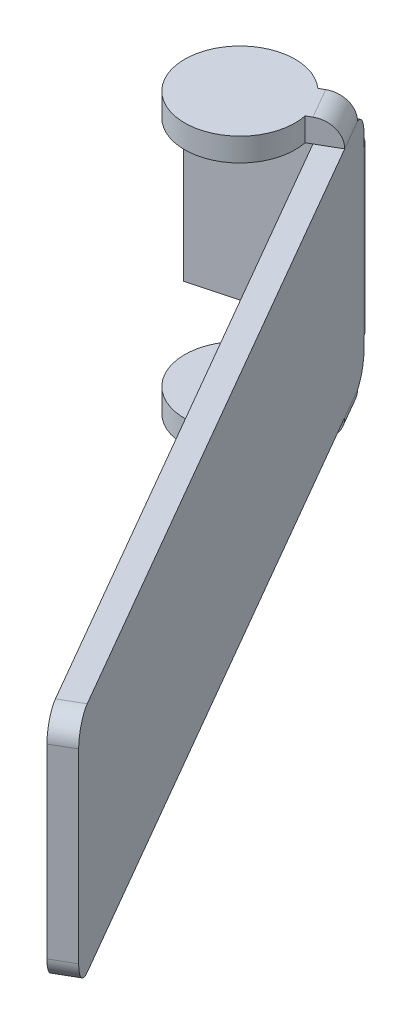
ISO-10303-21;
HEADER;
FILE_DESCRIPTION(('STEP AP214'),'2;1');
FILE_NAME('part.step','',(''),(''),'','','');
FILE_SCHEMA(('AUTOMOTIVE_DESIGN { 1 0 10303 214 1 1 1 1 }'));
ENDSEC;
DATA;
#1=APPLICATION_CONTEXT('core data for automotive mechanical design processes');
#2=APPLICATION_PROTOCOL_DEFINITION('international standard','automotive_design',2000,#1);
#3=PRODUCT_CONTEXT('',#1,'mechanical');
#4=PRODUCT('Part','Part','',(#3));
#5=PRODUCT_RELATED_PRODUCT_CATEGORY('part','',(#4));
#6=PRODUCT_DEFINITION_FORMATION('','',#4);
#7=PRODUCT_DEFINITION_CONTEXT('part definition',#1,'design');
#8=PRODUCT_DEFINITION('design','',#6,#7);
#9=PRODUCT_DEFINITION_SHAPE('','',#8);
#10=(LENGTH_UNIT() NAMED_UNIT(*) SI_UNIT(.MILLI.,.METRE.));
#11=(NAMED_UNIT(*) PLANE_ANGLE_UNIT() SI_UNIT($,.RADIAN.));
#12=(NAMED_UNIT(*) SI_UNIT($,.STERADIAN.) SOLID_ANGLE_UNIT());
#13=UNCERTAINTY_MEASURE_WITH_UNIT(LENGTH_MEASURE(1.E-05),#10,'distance_accuracy_value','');
#14=(GEOMETRIC_REPRESENTATION_CONTEXT(3) GLOBAL_UNCERTAINTY_ASSIGNED_CONTEXT((#13)) GLOBAL_UNIT_ASSIGNED_CONTEXT((#10,
#11,#12)) REPRESENTATION_CONTEXT('',''));
#15=CARTESIAN_POINT('',(0.,0.,0.));
#16=DIRECTION('',(0.,0.,1.));
#17=DIRECTION('',(1.,0.,0.));
#18=AXIS2_PLACEMENT_3D('',#15,#16,#17);
#19=CARTESIAN_POINT('',(94.3105301309,-97.95,18.44943405322));
#20=DIRECTION('',(0.,1.,0.));
#21=DIRECTION('',(0.,0.,1.));
#22=AXIS2_PLACEMENT_3D('',#19,#20,#21);
#23=PLANE('',#22);
#24=DIRECTION('',(0.866025403787722,0.,-0.499999999994313));
#25=VECTOR('',#24,1.);
#26=CARTESIAN_POINT('',(94.87326507878,-97.95,18.29774396034));
#27=LINE('',#26,#25);
#28=CARTESIAN_POINT('',(94.808012701891,-97.95,18.3354174377));
#29=VERTEX_POINT('',#28);
#30=CARTESIAN_POINT('',(94.765312374902,-97.95,18.3600704829828));
#31=VERTEX_POINT('',#30);
#32=EDGE_CURVE('E174',#29,#31,#27,.F.);
#33=ORIENTED_EDGE('',*,*,#32,.F.);
#34=DIRECTION('',(-0.50000000000021,0.,-0.866025403784317));
#35=VECTOR('',#34,1.);
#36=CARTESIAN_POINT('',(96.25752078541,-97.95,20.84603908433));
#37=LINE('',#36,#35);
#38=CARTESIAN_POINT('',(94.6580127018954,-97.949999949625,18.0756098165599));
#39=VERTEX_POINT('',#38);
#40=EDGE_CURVE('E146',#29,#39,#37,.T.);
#41=ORIENTED_EDGE('',*,*,#40,.T.);
#42=DIRECTION('',(0.866025403787722,0.,-0.499999999994313));
#43=VECTOR('',#42,1.);
#44=CARTESIAN_POINT('',(94.72326503323,-97.94999989925,18.0379363655));
#45=LINE('',#44,#43);
#46=CARTESIAN_POINT('',(94.6153122709678,-97.949999949625,18.1002629218509));
#47=VERTEX_POINT('',#46);
#48=EDGE_CURVE('E141',#39,#47,#45,.F.);
#49=ORIENTED_EDGE('',*,*,#48,.T.);
#50=CARTESIAN_POINT('',(94.3,-97.95,18.45551362713));
#51=DIRECTION('',(0.,-1.,0.));
#52=DIRECTION('',(0.,0.,-1.));
#53=AXIS2_PLACEMENT_3D('',#50,#51,#52);
#54=CIRCLE('',#53,0.4750000000021);
#55=EDGE_CURVE('E20',#31,#47,#54,.T.);
#56=ORIENTED_EDGE('',*,*,#55,.F.);
#57=EDGE_LOOP('',(#33,#41,#49,#56));
#58=FACE_BOUND('',#57,.T.);
#59=ADVANCED_FACE('F17',(#58),#23,.T.);
#60=CARTESIAN_POINT('',(94.3,-97.94081614968,18.45551362713));
#61=DIRECTION('',(0.,-1.,0.));
#62=DIRECTION('',(0.,0.,-1.));
#63=AXIS2_PLACEMENT_3D('',#60,#61,#62);
#64=CYLINDRICAL_SURFACE('',#63,0.4750000000021);
#65=DIRECTION('',(0.,1.,0.));
#66=VECTOR('',#65,1.);
#67=CARTESIAN_POINT('',(94.7653123749017,-98.05,18.3600704829829));
#68=LINE('',#67,#66);
#69=CARTESIAN_POINT('',(94.7653123749017,-98.15,18.360070482981));
#70=VERTEX_POINT('',#69);
#71=EDGE_CURVE('E159',#31,#70,#68,.F.);
#72=ORIENTED_EDGE('',*,*,#71,.F.);
#73=ORIENTED_EDGE('',*,*,#55,.T.);
#74=DIRECTION('',(0.,1.,0.));
#75=VECTOR('',#74,1.);
#76=CARTESIAN_POINT('',(94.615312167034,-98.05,18.1002629818571));
#77=LINE('',#76,#75);
#78=CARTESIAN_POINT('',(94.6153122709678,-98.15,18.1002629218509));
#79=VERTEX_POINT('',#78);
#80=EDGE_CURVE('E151',#47,#79,#77,.F.);
#81=ORIENTED_EDGE('',*,*,#80,.T.);
#82=CARTESIAN_POINT('',(94.3,-98.15,18.45551362713));
#83=DIRECTION('',(0.,-1.,0.));
#84=DIRECTION('',(0.,0.,-1.));
#85=AXIS2_PLACEMENT_3D('',#82,#83,#84);
#86=CIRCLE('',#85,0.4750000000021);
#87=EDGE_CURVE('E173',#79,#70,#86,.F.);
#88=ORIENTED_EDGE('',*,*,#87,.T.);
#89=EDGE_LOOP('',(#72,#73,#81,#88));
#90=FACE_BOUND('',#89,.T.);
#91=ADVANCED_FACE('F156',(#90),#64,.T.);
#92=CARTESIAN_POINT('',(93.54629438906,-96.95,18.11799855673));
#93=DIRECTION('',(0.965925826288354,0.,-0.258819045105188));
#94=DIRECTION('',(-0.258819045105188,0.,-0.965925826288354));
#95=AXIS2_PLACEMENT_3D('',#92,#93,#94);
#96=PLANE('',#95);
#97=DIRECTION('',(0.258819045097434,0.,0.965925826290431));
#98=VECTOR('',#97,1.);
#99=CARTESIAN_POINT('',(93.52041248455,-97.65,18.0214059741));
#100=LINE('',#99,#98);
#101=CARTESIAN_POINT('',(93.5204124845499,-97.65,18.0214059740998));
#102=VERTEX_POINT('',#101);
#103=CARTESIAN_POINT('',(93.57217629357,-97.65,18.2145911393599));
#104=VERTEX_POINT('',#103);
#105=EDGE_CURVE('E166',#102,#104,#100,.T.);
#106=ORIENTED_EDGE('',*,*,#105,.T.);
#107=DIRECTION('',(0.,1.,0.));
#108=VECTOR('',#107,1.);
#109=CARTESIAN_POINT('',(93.5721762935699,-96.95,18.2145911393598));
#110=LINE('',#109,#108);
#111=CARTESIAN_POINT('',(93.5721762935702,-96.25,18.2145911393599));
#112=VERTEX_POINT('',#111);
#113=EDGE_CURVE('E244',#112,#104,#110,.F.);
#114=ORIENTED_EDGE('',*,*,#113,.F.);
#115=DIRECTION('',(-0.258819045105188,0.,-0.965925826288354));
#116=VECTOR('',#115,1.);
#117=CARTESIAN_POINT('',(93.54629438906,-96.25,18.11799855673));
#118=LINE('',#117,#116);
#119=CARTESIAN_POINT('',(93.5204124845497,-96.25,18.0214059741));
#120=VERTEX_POINT('',#119);
#121=EDGE_CURVE('E161',#120,#112,#118,.F.);
#122=ORIENTED_EDGE('',*,*,#121,.F.);
#123=DIRECTION('',(0.,1.,0.));
#124=VECTOR('',#123,1.);
#125=CARTESIAN_POINT('',(93.5204124845499,-96.95,18.0214059740998));
#126=LINE('',#125,#124);
#127=EDGE_CURVE('E263',#120,#102,#126,.F.);
#128=ORIENTED_EDGE('',*,*,#127,.T.);
#129=EDGE_LOOP('',(#106,#114,#122,#128));
#130=FACE_BOUND('',#129,.T.);
#131=ADVANCED_FACE('F662',(#130),#96,.F.);
#132=CARTESIAN_POINT('',(94.07710258125,-96.95,18.07929654834));
#133=DIRECTION('',(0.258819045100197,0.,0.965925826289691));
#134=DIRECTION('',(0.965925826289691,0.,-0.258819045100197));
#135=AXIS2_PLACEMENT_3D('',#132,#133,#134);
#136=PLANE('',#135);
#137=ORIENTED_EDGE('',*,*,#113,.T.);
#138=DIRECTION('',(0.965925826289595,0.,-0.258819045100555));
#139=VECTOR('',#138,1.);
#140=CARTESIAN_POINT('',(93.57217629357,-97.65,18.21459113936));
#141=LINE('',#140,#139);
#142=CARTESIAN_POINT('',(94.5820288689307,-97.65,17.9440019573198));
#143=VERTEX_POINT('',#142);
#144=EDGE_CURVE('E267',#104,#143,#141,.T.);
#145=ORIENTED_EDGE('',*,*,#144,.T.);
#146=DIRECTION('',(0.,1.,0.));
#147=VECTOR('',#146,1.);
#148=CARTESIAN_POINT('',(94.5820288689312,-96.95,17.9440019573193));
#149=LINE('',#148,#147);
#150=CARTESIAN_POINT('',(94.582028868933,-96.25,17.9440019573189));
#151=VERTEX_POINT('',#150);
#152=EDGE_CURVE('E175',#143,#151,#149,.T.);
#153=ORIENTED_EDGE('',*,*,#152,.T.);
#154=DIRECTION('',(0.965925826289595,0.,-0.258819045100555));
#155=VECTOR('',#154,1.);
#156=CARTESIAN_POINT('',(93.57217629357,-96.25,18.21459113936));
#157=LINE('',#156,#155);
#158=EDGE_CURVE('E333',#112,#151,#157,.T.);
#159=ORIENTED_EDGE('',*,*,#158,.F.);
#160=EDGE_LOOP('',(#137,#145,#153,#159));
#161=FACE_BOUND('',#160,.T.);
#162=ADVANCED_FACE('F654',(#161),#136,.T.);
#163=CARTESIAN_POINT('',(94.3,-95.95918385032,18.45551362713));
#164=DIRECTION('',(0.,1.,0.));
#165=DIRECTION('',(0.,0.,1.));
#166=AXIS2_PLACEMENT_3D('',#163,#164,#165);
#167=CYLINDRICAL_SURFACE('',#166,0.4750000000021);
#168=DIRECTION('',(0.,1.,0.));
#169=VECTOR('',#168,1.);
#170=CARTESIAN_POINT('',(94.6153123748949,-95.85,18.1002628618411));
#171=LINE('',#170,#169);
#172=CARTESIAN_POINT('',(94.6153123748957,-95.75,18.1002628618406));
#173=VERTEX_POINT('',#172);
#174=CARTESIAN_POINT('',(94.6153123748957,-95.95,18.1002628618406));
#175=VERTEX_POINT('',#174);
#176=EDGE_CURVE('E259',#173,#175,#171,.F.);
#177=ORIENTED_EDGE('',*,*,#176,.T.);
#178=CARTESIAN_POINT('',(94.3,-95.95,18.45551362713));
#179=DIRECTION('',(0.,1.,0.));
#180=DIRECTION('',(0.,0.,1.));
#181=AXIS2_PLACEMENT_3D('',#178,#179,#180);
#182=CIRCLE('',#181,0.4750000000021);
#183=CARTESIAN_POINT('',(94.765312374902,-95.95,18.3600704829828));
#184=VERTEX_POINT('',#183);
#185=EDGE_CURVE('E243',#175,#184,#182,.T.);
#186=ORIENTED_EDGE('',*,*,#185,.T.);
#187=DIRECTION('',(0.,1.,0.));
#188=VECTOR('',#187,1.);
#189=CARTESIAN_POINT('',(94.7653123749017,-95.85,18.3600704829829));
#190=LINE('',#189,#188);
#191=CARTESIAN_POINT('',(94.765312374902,-95.75,18.3600704829828));
#192=VERTEX_POINT('',#191);
#193=EDGE_CURVE('E182',#192,#184,#190,.F.);
#194=ORIENTED_EDGE('',*,*,#193,.F.);
#195=CARTESIAN_POINT('',(94.3,-95.75,18.45551362713));
#196=DIRECTION('',(0.,1.,0.));
#197=DIRECTION('',(0.,0.,1.));
#198=AXIS2_PLACEMENT_3D('',#195,#196,#197);
#199=CIRCLE('',#198,0.4750000000021);
#200=EDGE_CURVE('E242',#173,#192,#199,.T.);
#201=ORIENTED_EDGE('',*,*,#200,.F.);
#202=EDGE_LOOP('',(#177,#186,#194,#201));
#203=FACE_BOUND('',#202,.T.);
#204=ADVANCED_FACE('F434',(#203),#167,.T.);
#205=CARTESIAN_POINT('',(94.31052494748,-95.95,18.44943704587));
#206=DIRECTION('',(0.,1.,0.));
#207=DIRECTION('',(0.,0.,1.));
#208=AXIS2_PLACEMENT_3D('',#205,#206,#207);
#209=PLANE('',#208);
#210=ORIENTED_EDGE('',*,*,#185,.F.);
#211=DIRECTION('',(0.866025403787722,0.,-0.499999999994313));
#212=VECTOR('',#211,1.);
#213=CARTESIAN_POINT('',(94.72326507877,-95.95,18.0379363392));
#214=LINE('',#213,#212);
#215=CARTESIAN_POINT('',(94.6580127018925,-95.95,18.0756098165581));
#216=VERTEX_POINT('',#215);
#217=EDGE_CURVE('E319',#175,#216,#214,.T.);
#218=ORIENTED_EDGE('',*,*,#217,.T.);
#219=DIRECTION('',(-0.50000000000021,0.,-0.866025403784317));
#220=VECTOR('',#219,1.);
#221=CARTESIAN_POINT('',(96.25752078541,-95.95,20.84603908433));
#222=LINE('',#221,#220);
#223=CARTESIAN_POINT('',(94.808012701891,-95.95,18.3354174377));
#224=VERTEX_POINT('',#223);
#225=EDGE_CURVE('E241',#216,#224,#222,.F.);
#226=ORIENTED_EDGE('',*,*,#225,.T.);
#227=DIRECTION('',(0.866025403787722,0.,-0.499999999994313));
#228=VECTOR('',#227,1.);
#229=CARTESIAN_POINT('',(94.87326507878,-95.95,18.29774396034));
#230=LINE('',#229,#228);
#231=EDGE_CURVE('E184',#184,#224,#230,.T.);
#232=ORIENTED_EDGE('',*,*,#231,.F.);
#233=EDGE_LOOP('',(#210,#218,#226,#232));
#234=FACE_BOUND('',#233,.T.);
#235=ADVANCED_FACE('F433',(#234),#209,.F.);
#236=CARTESIAN_POINT('',(94.31050625137,-95.75,18.44944784007));
#237=DIRECTION('',(0.,1.,0.));
#238=DIRECTION('',(0.,0.,1.));
#239=AXIS2_PLACEMENT_3D('',#236,#237,#238);
#240=PLANE('',#239);
#241=DIRECTION('',(0.866025403787722,0.,-0.499999999994313));
#242=VECTOR('',#241,1.);
#243=CARTESIAN_POINT('',(94.87326507878,-95.75,18.29774396034));
#244=LINE('',#243,#242);
#245=CARTESIAN_POINT('',(94.8080127018915,-95.75,18.3354174377002));
#246=VERTEX_POINT('',#245);
#247=EDGE_CURVE('E185',#246,#192,#244,.F.);
#248=ORIENTED_EDGE('',*,*,#247,.F.);
#249=DIRECTION('',(-0.499999999997611,0.,-0.866025403785818));
#250=VECTOR('',#249,1.);
#251=CARTESIAN_POINT('',(94.8126046270506,-95.75,18.3433708853797));
#252=LINE('',#251,#250);
#253=CARTESIAN_POINT('',(94.6580127018892,-95.75,18.0756098165592));
#254=VERTEX_POINT('',#253);
#255=EDGE_CURVE('E235',#254,#246,#252,.F.);
#256=ORIENTED_EDGE('',*,*,#255,.F.);
#257=DIRECTION('',(0.866025403787722,0.,-0.499999999994313));
#258=VECTOR('',#257,1.);
#259=CARTESIAN_POINT('',(94.72326507877,-95.75,18.0379363392));
#260=LINE('',#259,#258);
#261=EDGE_CURVE('E326',#254,#173,#260,.F.);
#262=ORIENTED_EDGE('',*,*,#261,.T.);
#263=ORIENTED_EDGE('',*,*,#200,.T.);
#264=EDGE_LOOP('',(#248,#256,#262,#263));
#265=FACE_BOUND('',#264,.T.);
#266=ADVANCED_FACE('F439',(#265),#240,.T.);
#267=CARTESIAN_POINT('',(94.87326507878,-95.85,18.29774396034));
#268=DIRECTION('',(0.499999999994313,0.,0.866025403787722));
#269=DIRECTION('',(0.866025403787722,0.,-0.499999999994313));
#270=AXIS2_PLACEMENT_3D('',#267,#268,#269);
#271=PLANE('',#270);
#272=DIRECTION('',(-0.866025403788345,0.,0.499999999993235));
#273=VECTOR('',#272,1.);
#274=CARTESIAN_POINT('',(94.98121778265,-95.95,18.2354174377));
#275=LINE('',#274,#273);
#276=CARTESIAN_POINT('',(94.9812177826505,-95.95,18.2354174376992));
#277=VERTEX_POINT('',#276);
#278=EDGE_CURVE('E310',#277,#224,#275,.T.);
#279=ORIENTED_EDGE('',*,*,#278,.F.);
#280=CARTESIAN_POINT('',(94.8080127018907,-95.95,18.3354174376996));
#281=DIRECTION('',(-0.499999999997611,0.,-0.866025403785818));
#282=DIRECTION('',(-0.866025403785818,0.,0.499999999997611));
#283=AXIS2_PLACEMENT_3D('',#280,#281,#282);
#284=CIRCLE('',#283,0.2);
#285=EDGE_CURVE('E232',#246,#277,#284,.T.);
#286=ORIENTED_EDGE('',*,*,#285,.F.);
#287=ORIENTED_EDGE('',*,*,#247,.T.);
#288=ORIENTED_EDGE('',*,*,#193,.T.);
#289=ORIENTED_EDGE('',*,*,#231,.T.);
#290=EDGE_LOOP('',(#279,#286,#287,#288,#289));
#291=FACE_BOUND('',#290,.T.);
#292=ADVANCED_FACE('F414',(#291),#271,.T.);
#293=CARTESIAN_POINT('',(96.25752078541,-96.95,20.84603908433));
#294=DIRECTION('',(0.866025403784317,0.,-0.50000000000021));
#295=DIRECTION('',(-0.50000000000021,0.,-0.866025403784317));
#296=AXIS2_PLACEMENT_3D('',#293,#294,#295);
#297=PLANE('',#296);
#298=ORIENTED_EDGE('',*,*,#152,.F.);
#299=DIRECTION('',(0.,1.,0.));
#300=VECTOR('',#299,1.);
#301=CARTESIAN_POINT('',(94.5820288689268,-96.95,17.9440019573118));
#302=LINE('',#301,#300);
#303=CARTESIAN_POINT('',(94.5820288689321,-97.75585341908,17.9440019573143));
#304=VERTEX_POINT('',#303);
#305=EDGE_CURVE('E179',#304,#143,#302,.T.);
#306=ORIENTED_EDGE('',*,*,#305,.F.);
#307=CARTESIAN_POINT('',(94.6820288689319,-97.75585341908,18.1172070380699));
#308=DIRECTION('',(0.866025403783331,0.,-0.500000000001918));
#309=DIRECTION('',(-0.500000000001918,0.,-0.866025403783331));
#310=AXIS2_PLACEMENT_3D('',#307,#308,#309);
#311=CIRCLE('',#310,0.1999999999987);
#312=EDGE_CURVE('E237',#39,#304,#311,.T.);
#313=ORIENTED_EDGE('',*,*,#312,.F.);
#314=ORIENTED_EDGE('',*,*,#40,.F.);
#315=DIRECTION('',(0.500000000000419,0.,0.866025403784197));
#316=VECTOR('',#315,1.);
#317=CARTESIAN_POINT('',(94.80801270189,-97.95,18.3354174377));
#318=LINE('',#317,#316);
#319=CARTESIAN_POINT('',(97.8330127018894,-97.95,23.574871130591));
#320=VERTEX_POINT('',#319);
#321=EDGE_CURVE('E286',#29,#320,#318,.T.);
#322=ORIENTED_EDGE('',*,*,#321,.T.);
#323=CARTESIAN_POINT('',(97.8330127018888,-97.75,23.574871130592));
#324=DIRECTION('',(-0.866025403783331,0.,0.500000000001918));
#325=DIRECTION('',(0.500000000001918,0.,0.866025403783331));
#326=AXIS2_PLACEMENT_3D('',#323,#324,#325);
#327=CIRCLE('',#326,0.2);
#328=CARTESIAN_POINT('',(97.9330127018898,-97.75,23.7480762113497));
#329=VERTEX_POINT('',#328);
#330=EDGE_CURVE('E219',#329,#320,#327,.F.);
#331=ORIENTED_EDGE('',*,*,#330,.F.);
#332=DIRECTION('',(0.,1.,0.));
#333=VECTOR('',#332,1.);
#334=CARTESIAN_POINT('',(97.9330127018904,-96.95,23.7480762113507));
#335=LINE('',#334,#333);
#336=CARTESIAN_POINT('',(97.9330127018913,-96.15,23.7480762113502));
#337=VERTEX_POINT('',#336);
#338=EDGE_CURVE('E307',#337,#329,#335,.F.);
#339=ORIENTED_EDGE('',*,*,#338,.F.);
#340=CARTESIAN_POINT('',(97.8330127018906,-96.15,23.574871130591));
#341=DIRECTION('',(-0.866025403783331,0.,0.500000000001918));
#342=DIRECTION('',(0.500000000001918,0.,0.866025403783331));
#343=AXIS2_PLACEMENT_3D('',#340,#341,#342);
#344=CIRCLE('',#343,0.2000000000034);
#345=CARTESIAN_POINT('',(97.8330127018908,-95.9499999999983,23.5748711305914));
#346=VERTEX_POINT('',#345);
#347=EDGE_CURVE('E224',#346,#337,#344,.F.);
#348=ORIENTED_EDGE('',*,*,#347,.F.);
#349=DIRECTION('',(0.500000000000419,0.,0.866025403784197));
#350=VECTOR('',#349,1.);
#351=CARTESIAN_POINT('',(94.80801270189,-95.95,18.3354174377));
#352=LINE('',#351,#350);
#353=EDGE_CURVE('E231',#224,#346,#352,.T.);
#354=ORIENTED_EDGE('',*,*,#353,.F.);
#355=ORIENTED_EDGE('',*,*,#225,.F.);
#356=CARTESIAN_POINT('',(94.6820288689323,-96.14414658092,18.11720703807));
#357=DIRECTION('',(-0.866025403783331,0.,0.500000000001918));
#358=DIRECTION('',(0.500000000001918,0.,0.866025403783331));
#359=AXIS2_PLACEMENT_3D('',#356,#357,#358);
#360=CIRCLE('',#359,0.1999999999986);
#361=CARTESIAN_POINT('',(94.5820288689323,-96.14414658092,17.9440019573177));
#362=VERTEX_POINT('',#361);
#363=EDGE_CURVE('E239',#362,#216,#360,.F.);
#364=ORIENTED_EDGE('',*,*,#363,.F.);
#365=DIRECTION('',(0.,1.,0.));
#366=VECTOR('',#365,1.);
#367=CARTESIAN_POINT('',(94.5820288689312,-96.95,17.9440019573193));
#368=LINE('',#367,#366);
#369=EDGE_CURVE('E178',#151,#362,#368,.T.);
#370=ORIENTED_EDGE('',*,*,#369,.F.);
#371=EDGE_LOOP('',(#298,#306,#313,#314,#322,#331,#339,#348,#354,#355,#364,#370));
#372=FACE_BOUND('',#371,.T.);
#373=ADVANCED_FACE('F431',(#372),#297,.F.);
#374=CARTESIAN_POINT('',(94.87326507878,-98.05,18.29774396034));
#375=DIRECTION('',(0.499999999994313,0.,0.866025403787722));
#376=DIRECTION('',(0.866025403787722,0.,-0.499999999994313));
#377=AXIS2_PLACEMENT_3D('',#374,#375,#376);
#378=PLANE('',#377);
#379=DIRECTION('',(0.866025403803395,0.,-0.499999999967167));
#380=VECTOR('',#379,1.);
#381=CARTESIAN_POINT('',(94.7653123749,-98.15,18.36007048298));
#382=LINE('',#381,#380);
#383=CARTESIAN_POINT('',(94.8080127018914,-98.15,18.3354174377003));
#384=VERTEX_POINT('',#383);
#385=EDGE_CURVE('E152',#70,#384,#382,.T.);
#386=ORIENTED_EDGE('',*,*,#385,.T.);
#387=CARTESIAN_POINT('',(94.8080127018929,-97.95,18.3354174377006));
#388=DIRECTION('',(0.500000000001918,0.,0.866025403783331));
#389=DIRECTION('',(0.866025403783331,0.,-0.500000000001918));
#390=AXIS2_PLACEMENT_3D('',#387,#388,#389);
#391=CIRCLE('',#390,0.2);
#392=CARTESIAN_POINT('',(94.9812177826518,-97.95,18.2354174377001));
#393=VERTEX_POINT('',#392);
#394=EDGE_CURVE('E215',#393,#384,#391,.F.);
#395=ORIENTED_EDGE('',*,*,#394,.F.);
#396=DIRECTION('',(-0.866025403788345,0.,0.499999999993235));
#397=VECTOR('',#396,1.);
#398=CARTESIAN_POINT('',(94.98121778265,-97.95,18.2354174377));
#399=LINE('',#398,#397);
#400=EDGE_CURVE('E222',#393,#29,#399,.T.);
#401=ORIENTED_EDGE('',*,*,#400,.T.);
#402=ORIENTED_EDGE('',*,*,#32,.T.);
#403=ORIENTED_EDGE('',*,*,#71,.T.);
#404=EDGE_LOOP('',(#386,#395,#401,#402,#403));
#405=FACE_BOUND('',#404,.T.);
#406=ADVANCED_FACE('F609',(#405),#378,.T.);
#407=CARTESIAN_POINT('',(94.31050625137,-98.15,18.44944784007));
#408=DIRECTION('',(0.,1.,0.));
#409=DIRECTION('',(0.,0.,1.));
#410=AXIS2_PLACEMENT_3D('',#407,#408,#409);
#411=PLANE('',#410);
#412=ORIENTED_EDGE('',*,*,#87,.F.);
#413=DIRECTION('',(0.866025403787722,0.,-0.499999999994313));
#414=VECTOR('',#413,1.);
#415=CARTESIAN_POINT('',(94.72326503323,-98.15,18.0379363655));
#416=LINE('',#415,#414);
#417=CARTESIAN_POINT('',(94.6580127018892,-98.15,18.0756098165624));
#418=VERTEX_POINT('',#417);
#419=EDGE_CURVE('E164',#79,#418,#416,.T.);
#420=ORIENTED_EDGE('',*,*,#419,.T.);
#421=DIRECTION('',(0.500000000001918,0.,0.866025403783331));
#422=VECTOR('',#421,1.);
#423=CARTESIAN_POINT('',(94.6534207767281,-98.15,18.0676563688811));
#424=LINE('',#423,#422);
#425=EDGE_CURVE('E214',#384,#418,#424,.F.);
#426=ORIENTED_EDGE('',*,*,#425,.F.);
#427=ORIENTED_EDGE('',*,*,#385,.F.);
#428=EDGE_LOOP('',(#412,#420,#426,#427));
#429=FACE_BOUND('',#428,.T.);
#430=ADVANCED_FACE('F601',(#429),#411,.F.);
#431=CARTESIAN_POINT('',(94.72326503323,-98.05,18.0379363655));
#432=DIRECTION('',(0.499999999994313,0.,0.866025403787722));
#433=DIRECTION('',(0.866025403787722,0.,-0.499999999994313));
#434=AXIS2_PLACEMENT_3D('',#431,#432,#433);
#435=PLANE('',#434);
#436=ORIENTED_EDGE('',*,*,#419,.F.);
#437=ORIENTED_EDGE('',*,*,#80,.F.);
#438=ORIENTED_EDGE('',*,*,#48,.F.);
#439=DIRECTION('',(0.866025403783331,0.,-0.500000000001918));
#440=VECTOR('',#439,1.);
#441=CARTESIAN_POINT('',(94.6500592542132,-97.95,18.0802017417195));
#442=LINE('',#441,#440);
#443=CARTESIAN_POINT('',(94.8312177826484,-97.95,17.9756098165597));
#444=VERTEX_POINT('',#443);
#445=EDGE_CURVE('E213',#444,#39,#442,.F.);
#446=ORIENTED_EDGE('',*,*,#445,.F.);
#447=CARTESIAN_POINT('',(94.6580127018893,-97.95,18.0756098165604));
#448=DIRECTION('',(0.500000000001918,0.,0.866025403783331));
#449=DIRECTION('',(0.866025403783331,0.,-0.500000000001918));
#450=AXIS2_PLACEMENT_3D('',#447,#448,#449);
#451=CIRCLE('',#450,0.2);
#452=EDGE_CURVE('E210',#418,#444,#451,.T.);
#453=ORIENTED_EDGE('',*,*,#452,.F.);
#454=EDGE_LOOP('',(#436,#437,#438,#446,#453));
#455=FACE_BOUND('',#454,.T.);
#456=ADVANCED_FACE('F162',(#455),#435,.F.);
#457=CARTESIAN_POINT('',(94.11540883032,-97.65,17.94564491796));
#458=DIRECTION('',(0.,1.,0.));
#459=DIRECTION('',(0.,0.,1.));
#460=AXIS2_PLACEMENT_3D('',#457,#458,#459);
#461=PLANE('',#460);
#462=ORIENTED_EDGE('',*,*,#144,.F.);
#463=ORIENTED_EDGE('',*,*,#105,.F.);
#464=DIRECTION('',(0.965925826289691,0.,-0.258819045100197));
#465=VECTOR('',#464,1.);
#466=CARTESIAN_POINT('',(94.02533877223,-97.65,17.88611138308));
#467=LINE('',#466,#465);
#468=CARTESIAN_POINT('',(94.5302650599097,-97.65,17.7508167920598));
#469=VERTEX_POINT('',#468);
#470=EDGE_CURVE('E266',#102,#469,#467,.T.);
#471=ORIENTED_EDGE('',*,*,#470,.T.);
#472=CARTESIAN_POINT('',(94.58202886893,-97.65,17.94400195732));
#473=DIRECTION('',(0.,1.,0.));
#474=DIRECTION('',(0.,0.,1.));
#475=AXIS2_PLACEMENT_3D('',#472,#473,#474);
#476=CIRCLE('',#475,0.2000000000027);
#477=CARTESIAN_POINT('',(94.7552339496904,-97.65,17.8440019573193));
#478=VERTEX_POINT('',#477);
#479=EDGE_CURVE('E206',#478,#469,#476,.T.);
#480=ORIENTED_EDGE('',*,*,#479,.F.);
#481=DIRECTION('',(0.866025403784162,0.,-0.500000000000478));
#482=VECTOR('',#481,1.);
#483=CARTESIAN_POINT('',(94.66863140931,-97.65,17.89400195732));
#484=LINE('',#483,#482);
#485=EDGE_CURVE('E209',#478,#143,#484,.F.);
#486=ORIENTED_EDGE('',*,*,#485,.T.);
#487=EDGE_LOOP('',(#462,#463,#471,#480,#486));
#488=FACE_BOUND('',#487,.T.);
#489=ADVANCED_FACE('F344',(#488),#461,.F.);
#490=CARTESIAN_POINT('',(94.02533877223,-96.95,17.88611138308));
#491=DIRECTION('',(0.258819045100197,0.,0.965925826289691));
#492=DIRECTION('',(0.965925826289691,0.,-0.258819045100197));
#493=AXIS2_PLACEMENT_3D('',#490,#491,#492);
#494=PLANE('',#493);
#495=ORIENTED_EDGE('',*,*,#127,.F.);
#496=DIRECTION('',(-0.965925826289595,0.,0.258819045100555));
#497=VECTOR('',#496,1.);
#498=CARTESIAN_POINT('',(94.53026505991,-96.25,17.75081679206));
#499=LINE('',#498,#497);
#500=CARTESIAN_POINT('',(94.5302650599096,-96.25,17.7508167920597));
#501=VERTEX_POINT('',#500);
#502=EDGE_CURVE('E330',#501,#120,#499,.T.);
#503=ORIENTED_EDGE('',*,*,#502,.F.);
#504=DIRECTION('',(0.,1.,0.));
#505=VECTOR('',#504,1.);
#506=CARTESIAN_POINT('',(94.5302650599098,-97.678,17.7508167920593));
#507=LINE('',#506,#505);
#508=EDGE_CURVE('E205',#469,#501,#507,.T.);
#509=ORIENTED_EDGE('',*,*,#508,.F.);
#510=ORIENTED_EDGE('',*,*,#470,.F.);
#511=EDGE_LOOP('',(#495,#503,#509,#510));
#512=FACE_BOUND('',#511,.T.);
#513=ADVANCED_FACE('F350',(#512),#494,.F.);
#514=CARTESIAN_POINT('',(94.11540883032,-96.25,17.94564491796));
#515=DIRECTION('',(0.,1.,0.));
#516=DIRECTION('',(0.,0.,1.));
#517=AXIS2_PLACEMENT_3D('',#514,#515,#516);
#518=PLANE('',#517);
#519=DIRECTION('',(0.866025403784162,0.,-0.500000000000478));
#520=VECTOR('',#519,1.);
#521=CARTESIAN_POINT('',(94.66863140931,-96.25,17.89400195732));
#522=LINE('',#521,#520);
#523=CARTESIAN_POINT('',(94.7552339496904,-96.25,17.8440019573193));
#524=VERTEX_POINT('',#523);
#525=EDGE_CURVE('E204',#151,#524,#522,.T.);
#526=ORIENTED_EDGE('',*,*,#525,.T.);
#527=CARTESIAN_POINT('',(94.58202886893,-96.25,17.94400195732));
#528=DIRECTION('',(0.,1.,0.));
#529=DIRECTION('',(0.,0.,1.));
#530=AXIS2_PLACEMENT_3D('',#527,#528,#529);
#531=CIRCLE('',#530,0.2000000000027);
#532=EDGE_CURVE('E201',#501,#524,#531,.F.);
#533=ORIENTED_EDGE('',*,*,#532,.F.);
#534=ORIENTED_EDGE('',*,*,#502,.T.);
#535=ORIENTED_EDGE('',*,*,#121,.T.);
#536=ORIENTED_EDGE('',*,*,#158,.T.);
#537=EDGE_LOOP('',(#526,#533,#534,#535,#536));
#538=FACE_BOUND('',#537,.T.);
#539=ADVANCED_FACE('F428',(#538),#518,.T.);
#540=CARTESIAN_POINT('',(94.72326507877,-95.85,18.0379363392));
#541=DIRECTION('',(0.499999999994313,0.,0.866025403787722));
#542=DIRECTION('',(0.866025403787722,0.,-0.499999999994313));
#543=AXIS2_PLACEMENT_3D('',#540,#541,#542);
#544=PLANE('',#543);
#545=ORIENTED_EDGE('',*,*,#176,.F.);
#546=ORIENTED_EDGE('',*,*,#261,.F.);
#547=CARTESIAN_POINT('',(94.6580127018899,-95.95,18.0756098165612));
#548=DIRECTION('',(-0.499999999997611,0.,-0.866025403785818));
#549=DIRECTION('',(-0.866025403785818,0.,0.499999999997611));
#550=AXIS2_PLACEMENT_3D('',#547,#548,#549);
#551=CIRCLE('',#550,0.2);
#552=CARTESIAN_POINT('',(94.8312177826486,-95.9500000000001,17.9756098165598));
#553=VERTEX_POINT('',#552);
#554=EDGE_CURVE('E228',#553,#254,#551,.F.);
#555=ORIENTED_EDGE('',*,*,#554,.F.);
#556=DIRECTION('',(-0.866025403783331,0.,0.500000000001918));
#557=VECTOR('',#556,1.);
#558=CARTESIAN_POINT('',(94.8391712303321,-95.9500000000006,17.9710178913976));
#559=LINE('',#558,#557);
#560=EDGE_CURVE('E380',#216,#553,#559,.F.);
#561=ORIENTED_EDGE('',*,*,#560,.F.);
#562=ORIENTED_EDGE('',*,*,#217,.F.);
#563=EDGE_LOOP('',(#545,#546,#555,#561,#562));
#564=FACE_BOUND('',#563,.T.);
#565=ADVANCED_FACE('F440',(#564),#544,.F.);
#566=CARTESIAN_POINT('',(94.81260462705,-95.95,18.34337088538));
#567=DIRECTION('',(-0.499999999997611,0.,-0.866025403785818));
#568=DIRECTION('',(-0.866025403785818,0.,0.499999999997611));
#569=AXIS2_PLACEMENT_3D('',#566,#567,#568);
#570=CYLINDRICAL_SURFACE('',#569,0.2);
#571=DIRECTION('',(-0.50000000000021,0.,-0.866025403784317));
#572=VECTOR('',#571,1.);
#573=CARTESIAN_POINT('',(96.43072586617,-95.95,20.74603908433));
#574=LINE('',#573,#572);
#575=EDGE_CURVE('E377',#553,#277,#574,.F.);
#576=ORIENTED_EDGE('',*,*,#575,.F.);
#577=ORIENTED_EDGE('',*,*,#554,.T.);
#578=ORIENTED_EDGE('',*,*,#255,.T.);
#579=ORIENTED_EDGE('',*,*,#285,.T.);
#580=EDGE_LOOP('',(#576,#577,#578,#579));
#581=FACE_BOUND('',#580,.T.);
#582=ADVANCED_FACE('F416',(#581),#570,.T.);
#583=CARTESIAN_POINT('',(96.40711524227,-95.95,20.90514428415));
#584=DIRECTION('',(0.,1.,0.));
#585=DIRECTION('',(0.,0.,1.));
#586=AXIS2_PLACEMENT_3D('',#583,#584,#585);
#587=PLANE('',#586);
#588=DIRECTION('',(-0.50000000000021,0.,-0.866025403784317));
#589=VECTOR('',#588,1.);
#590=CARTESIAN_POINT('',(96.43072586617,-95.95,20.74603908433));
#591=LINE('',#590,#589);
#592=CARTESIAN_POINT('',(98.0062177826498,-95.9499999999992,23.4748711305896));
#593=VERTEX_POINT('',#592);
#594=EDGE_CURVE('E200',#277,#593,#591,.F.);
#595=ORIENTED_EDGE('',*,*,#594,.F.);
#596=ORIENTED_EDGE('',*,*,#278,.T.);
#597=ORIENTED_EDGE('',*,*,#353,.T.);
#598=DIRECTION('',(-0.866025403783331,0.,0.500000000001918));
#599=VECTOR('',#598,1.);
#600=CARTESIAN_POINT('',(98.0141712303304,-95.9499999999966,23.4702792054307));
#601=LINE('',#600,#599);
#602=EDGE_CURVE('E227',#593,#346,#601,.T.);
#603=ORIENTED_EDGE('',*,*,#602,.F.);
#604=EDGE_LOOP('',(#595,#596,#597,#603));
#605=FACE_BOUND('',#604,.T.);
#606=ADVANCED_FACE('F408',(#605),#587,.T.);
#607=CARTESIAN_POINT('',(98.01417123033,-96.15,23.47027920543));
#608=DIRECTION('',(-0.866025403783331,0.,0.500000000001918));
#609=DIRECTION('',(0.500000000001918,0.,0.866025403783331));
#610=AXIS2_PLACEMENT_3D('',#607,#608,#609);
#611=CYLINDRICAL_SURFACE('',#610,0.2000000000034);
#612=ORIENTED_EDGE('',*,*,#602,.T.);
#613=ORIENTED_EDGE('',*,*,#347,.T.);
#614=DIRECTION('',(0.866025403784162,0.,-0.500000000000478));
#615=VECTOR('',#614,1.);
#616=CARTESIAN_POINT('',(98.01961524227,-96.15,23.69807621135));
#617=LINE('',#616,#615);
#618=CARTESIAN_POINT('',(98.1062177826513,-96.15,23.6480762113485));
#619=VERTEX_POINT('',#618);
#620=EDGE_CURVE('E226',#619,#337,#617,.F.);
#621=ORIENTED_EDGE('',*,*,#620,.F.);
#622=CARTESIAN_POINT('',(98.0062177826479,-96.15,23.4748711305903));
#623=DIRECTION('',(-0.866025403783331,0.,0.500000000001918));
#624=DIRECTION('',(0.500000000001918,0.,0.866025403783331));
#625=AXIS2_PLACEMENT_3D('',#622,#623,#624);
#626=CIRCLE('',#625,0.2000000000034);
#627=EDGE_CURVE('E197',#593,#619,#626,.F.);
#628=ORIENTED_EDGE('',*,*,#627,.F.);
#629=EDGE_LOOP('',(#612,#613,#621,#628));
#630=FACE_BOUND('',#629,.T.);
#631=ADVANCED_FACE('F483',(#630),#611,.T.);
#632=CARTESIAN_POINT('',(98.01961524227,-96.95,23.69807621135));
#633=DIRECTION('',(0.500000000000478,0.,0.866025403784162));
#634=DIRECTION('',(0.866025403784162,0.,-0.500000000000478));
#635=AXIS2_PLACEMENT_3D('',#632,#633,#634);
#636=PLANE('',#635);
#637=ORIENTED_EDGE('',*,*,#338,.T.);
#638=DIRECTION('',(-0.866025403783331,0.,0.500000000001918));
#639=VECTOR('',#638,1.);
#640=CARTESIAN_POINT('',(98.1141712303304,-97.75,23.6434842861867));
#641=LINE('',#640,#639);
#642=CARTESIAN_POINT('',(98.1062177826509,-97.75,23.6480762113475));
#643=VERTEX_POINT('',#642);
#644=EDGE_CURVE('E223',#643,#329,#641,.T.);
#645=ORIENTED_EDGE('',*,*,#644,.F.);
#646=DIRECTION('',(0.,1.,0.));
#647=VECTOR('',#646,1.);
#648=CARTESIAN_POINT('',(98.1062177826532,-96.95,23.6480762113482));
#649=LINE('',#648,#647);
#650=EDGE_CURVE('E196',#619,#643,#649,.F.);
#651=ORIENTED_EDGE('',*,*,#650,.F.);
#652=ORIENTED_EDGE('',*,*,#620,.T.);
#653=EDGE_LOOP('',(#637,#645,#651,#652));
#654=FACE_BOUND('',#653,.T.);
#655=ADVANCED_FACE('F479',(#654),#636,.T.);
#656=CARTESIAN_POINT('',(98.01417123033,-97.75,23.47027920543));
#657=DIRECTION('',(-0.866025403783331,0.,0.500000000001918));
#658=DIRECTION('',(0.500000000001918,0.,0.866025403783331));
#659=AXIS2_PLACEMENT_3D('',#656,#657,#658);
#660=CYLINDRICAL_SURFACE('',#659,0.2);
#661=ORIENTED_EDGE('',*,*,#644,.T.);
#662=ORIENTED_EDGE('',*,*,#330,.T.);
#663=DIRECTION('',(0.866025403788312,0.,-0.499999999993291));
#664=VECTOR('',#663,1.);
#665=CARTESIAN_POINT('',(97.83301270189,-97.95,23.57487113059));
#666=LINE('',#665,#664);
#667=CARTESIAN_POINT('',(98.0062177826507,-97.95,23.4748711305891));
#668=VERTEX_POINT('',#667);
#669=EDGE_CURVE('E218',#320,#668,#666,.T.);
#670=ORIENTED_EDGE('',*,*,#669,.T.);
#671=CARTESIAN_POINT('',(98.0062177826496,-97.75,23.4748711305893));
#672=DIRECTION('',(-0.866025403783331,0.,0.500000000001918));
#673=DIRECTION('',(0.500000000001918,0.,0.866025403783331));
#674=AXIS2_PLACEMENT_3D('',#671,#672,#673);
#675=CIRCLE('',#674,0.2);
#676=EDGE_CURVE('E192',#643,#668,#675,.F.);
#677=ORIENTED_EDGE('',*,*,#676,.F.);
#678=EDGE_LOOP('',(#661,#662,#670,#677));
#679=FACE_BOUND('',#678,.T.);
#680=ADVANCED_FACE('F475',(#679),#660,.T.);
#681=CARTESIAN_POINT('',(96.40711524227,-97.95,20.90514428415));
#682=DIRECTION('',(0.,1.,0.));
#683=DIRECTION('',(0.,0.,1.));
#684=AXIS2_PLACEMENT_3D('',#681,#682,#683);
#685=PLANE('',#684);
#686=ORIENTED_EDGE('',*,*,#669,.F.);
#687=ORIENTED_EDGE('',*,*,#321,.F.);
#688=ORIENTED_EDGE('',*,*,#400,.F.);
#689=DIRECTION('',(-0.50000000000021,0.,-0.866025403784317));
#690=VECTOR('',#689,1.);
#691=CARTESIAN_POINT('',(96.43072586617,-97.95,20.74603908433));
#692=LINE('',#691,#690);
#693=EDGE_CURVE('E195',#668,#393,#692,.T.);
#694=ORIENTED_EDGE('',*,*,#693,.F.);
#695=EDGE_LOOP('',(#686,#687,#688,#694));
#696=FACE_BOUND('',#695,.T.);
#697=ADVANCED_FACE('F471',(#696),#685,.F.);
#698=CARTESIAN_POINT('',(94.65342077673,-97.95,18.06765636888));
#699=DIRECTION('',(0.500000000001918,0.,0.866025403783331));
#700=DIRECTION('',(0.866025403783331,0.,-0.500000000001918));
#701=AXIS2_PLACEMENT_3D('',#698,#699,#700);
#702=CYLINDRICAL_SURFACE('',#701,0.2);
#703=ORIENTED_EDGE('',*,*,#452,.T.);
#704=DIRECTION('',(-0.50000000000021,0.,-0.866025403784317));
#705=VECTOR('',#704,1.);
#706=CARTESIAN_POINT('',(96.43072586617,-97.95,20.74603908433));
#707=LINE('',#706,#705);
#708=EDGE_CURVE('E191',#393,#444,#707,.T.);
#709=ORIENTED_EDGE('',*,*,#708,.F.);
#710=ORIENTED_EDGE('',*,*,#394,.T.);
#711=ORIENTED_EDGE('',*,*,#425,.T.);
#712=EDGE_LOOP('',(#703,#709,#710,#711));
#713=FACE_BOUND('',#712,.T.);
#714=ADVANCED_FACE('F467',(#713),#702,.T.);
#715=CARTESIAN_POINT('',(94.67407542125,-97.75585341908,18.12179896323));
#716=DIRECTION('',(0.866025403783331,0.,-0.500000000001918));
#717=DIRECTION('',(-0.500000000001918,0.,-0.866025403783331));
#718=AXIS2_PLACEMENT_3D('',#715,#716,#717);
#719=CYLINDRICAL_SURFACE('',#718,0.1999999999987);
#720=DIRECTION('',(0.866025403784162,0.,-0.500000000000478));
#721=VECTOR('',#720,1.);
#722=CARTESIAN_POINT('',(94.66863140931,-97.75585341908,17.89400195732));
#723=LINE('',#722,#721);
#724=CARTESIAN_POINT('',(94.7552339496905,-97.75585341908,17.8440019573195));
#725=VERTEX_POINT('',#724);
#726=EDGE_CURVE('E387',#304,#725,#723,.T.);
#727=ORIENTED_EDGE('',*,*,#726,.T.);
#728=CARTESIAN_POINT('',(94.8552339496868,-97.75585341908,18.0172070380705));
#729=DIRECTION('',(0.866025403783331,0.,-0.500000000001918));
#730=DIRECTION('',(-0.500000000001918,0.,-0.866025403783331));
#731=AXIS2_PLACEMENT_3D('',#728,#729,#730);
#732=CIRCLE('',#731,0.1999999999987);
#733=EDGE_CURVE('E187',#444,#725,#732,.T.);
#734=ORIENTED_EDGE('',*,*,#733,.F.);
#735=ORIENTED_EDGE('',*,*,#445,.T.);
#736=ORIENTED_EDGE('',*,*,#312,.T.);
#737=EDGE_LOOP('',(#727,#734,#735,#736));
#738=FACE_BOUND('',#737,.T.);
#739=ADVANCED_FACE('F464',(#738),#719,.T.);
#740=CARTESIAN_POINT('',(94.66863140931,-97.70292670954,17.89400195732));
#741=DIRECTION('',(0.500000000000478,0.,0.866025403784162));
#742=DIRECTION('',(0.866025403784162,0.,-0.500000000000478));
#743=AXIS2_PLACEMENT_3D('',#740,#741,#742);
#744=PLANE('',#743);
#745=ORIENTED_EDGE('',*,*,#485,.F.);
#746=DIRECTION('',(0.,1.,0.));
#747=VECTOR('',#746,1.);
#748=CARTESIAN_POINT('',(94.7552339496912,-96.95,17.8440019573193));
#749=LINE('',#748,#747);
#750=EDGE_CURVE('E190',#725,#478,#749,.T.);
#751=ORIENTED_EDGE('',*,*,#750,.F.);
#752=ORIENTED_EDGE('',*,*,#726,.F.);
#753=ORIENTED_EDGE('',*,*,#305,.T.);
#754=EDGE_LOOP('',(#745,#751,#752,#753));
#755=FACE_BOUND('',#754,.T.);
#756=ADVANCED_FACE('F461',(#755),#744,.F.);
#757=CARTESIAN_POINT('',(94.58202886893,-97.678,17.94400195732));
#758=DIRECTION('',(0.,1.,0.));
#759=DIRECTION('',(0.,0.,1.));
#760=AXIS2_PLACEMENT_3D('',#757,#758,#759);
#761=CYLINDRICAL_SURFACE('',#760,0.2000000000027);
#762=ORIENTED_EDGE('',*,*,#508,.T.);
#763=ORIENTED_EDGE('',*,*,#532,.T.);
#764=DIRECTION('',(0.,1.,0.));
#765=VECTOR('',#764,1.);
#766=CARTESIAN_POINT('',(94.7552339496912,-96.95,17.8440019573193));
#767=LINE('',#766,#765);
#768=EDGE_CURVE('E356',#478,#524,#767,.T.);
#769=ORIENTED_EDGE('',*,*,#768,.F.);
#770=ORIENTED_EDGE('',*,*,#479,.T.);
#771=EDGE_LOOP('',(#762,#763,#769,#770));
#772=FACE_BOUND('',#771,.T.);
#773=ADVANCED_FACE('F354',(#772),#761,.T.);
#774=CARTESIAN_POINT('',(94.66863140931,-96.19707329046,17.89400195732));
#775=DIRECTION('',(0.500000000000478,0.,0.866025403784162));
#776=DIRECTION('',(0.866025403784162,0.,-0.500000000000478));
#777=AXIS2_PLACEMENT_3D('',#774,#775,#776);
#778=PLANE('',#777);
#779=ORIENTED_EDGE('',*,*,#525,.F.);
#780=ORIENTED_EDGE('',*,*,#369,.T.);
#781=DIRECTION('',(-0.866025403783331,0.,0.500000000001918));
#782=VECTOR('',#781,1.);
#783=CARTESIAN_POINT('',(94.7631873973703,-96.14414658092,17.8394100321546));
#784=LINE('',#783,#782);
#785=CARTESIAN_POINT('',(94.7552339496886,-96.14414658092,17.8440019573177));
#786=VERTEX_POINT('',#785);
#787=EDGE_CURVE('E35',#786,#362,#784,.T.);
#788=ORIENTED_EDGE('',*,*,#787,.F.);
#789=DIRECTION('',(0.,1.,0.));
#790=VECTOR('',#789,1.);
#791=CARTESIAN_POINT('',(94.7552339496912,-96.95,17.8440019573193));
#792=LINE('',#791,#790);
#793=EDGE_CURVE('E26',#524,#786,#792,.T.);
#794=ORIENTED_EDGE('',*,*,#793,.F.);
#795=EDGE_LOOP('',(#779,#780,#788,#794));
#796=FACE_BOUND('',#795,.T.);
#797=ADVANCED_FACE('F423',(#796),#778,.F.);
#798=CARTESIAN_POINT('',(94.86318739737,-96.14414658092,18.01261511291));
#799=DIRECTION('',(-0.866025403783331,0.,0.500000000001918));
#800=DIRECTION('',(0.500000000001918,0.,0.866025403783331));
#801=AXIS2_PLACEMENT_3D('',#798,#799,#800);
#802=CYLINDRICAL_SURFACE('',#801,0.1999999999986);
#803=ORIENTED_EDGE('',*,*,#787,.T.);
#804=ORIENTED_EDGE('',*,*,#363,.T.);
#805=ORIENTED_EDGE('',*,*,#560,.T.);
#806=CARTESIAN_POINT('',(94.8552339496869,-96.14414658092,18.0172070380708));
#807=DIRECTION('',(-0.866025403783331,0.,0.500000000001918));
#808=DIRECTION('',(0.500000000001918,0.,0.866025403783331));
#809=AXIS2_PLACEMENT_3D('',#806,#807,#808);
#810=CIRCLE('',#809,0.1999999999986);
#811=EDGE_CURVE('E11',#786,#553,#810,.F.);
#812=ORIENTED_EDGE('',*,*,#811,.F.);
#813=EDGE_LOOP('',(#803,#804,#805,#812));
#814=FACE_BOUND('',#813,.T.);
#815=ADVANCED_FACE('F419',(#814),#802,.T.);
#816=CARTESIAN_POINT('',(96.43072586617,-96.95,20.74603908433));
#817=DIRECTION('',(0.866025403784317,0.,-0.50000000000021));
#818=DIRECTION('',(-0.50000000000021,0.,-0.866025403784317));
#819=AXIS2_PLACEMENT_3D('',#816,#817,#818);
#820=PLANE('',#819);
#821=ORIENTED_EDGE('',*,*,#793,.T.);
#822=ORIENTED_EDGE('',*,*,#811,.T.);
#823=ORIENTED_EDGE('',*,*,#575,.T.);
#824=ORIENTED_EDGE('',*,*,#594,.T.);
#825=ORIENTED_EDGE('',*,*,#627,.T.);
#826=ORIENTED_EDGE('',*,*,#650,.T.);
#827=ORIENTED_EDGE('',*,*,#676,.T.);
#828=ORIENTED_EDGE('',*,*,#693,.T.);
#829=ORIENTED_EDGE('',*,*,#708,.T.);
#830=ORIENTED_EDGE('',*,*,#733,.T.);
#831=ORIENTED_EDGE('',*,*,#750,.T.);
#832=ORIENTED_EDGE('',*,*,#768,.T.);
#833=EDGE_LOOP('',(#821,#822,#823,#824,#825,#826,#827,#828,#829,#830,#831,#832));
#834=FACE_BOUND('',#833,.T.);
#835=ADVANCED_FACE('F362',(#834),#820,.T.);
#836=CLOSED_SHELL('',(#59,#91,#131,#162,#204,#235,#266,#292,#373,#406,#430,#456,#489,#513,#539,
#565,#582,#606,#631,#655,#680,#697,#714,#739,#756,#773,#797,#815,#835));
#837=MANIFOLD_SOLID_BREP('B1',#836);
#838=ADVANCED_BREP_SHAPE_REPRESENTATION('',(#18,#837),#14);
#839=SHAPE_DEFINITION_REPRESENTATION(#9,#838);
ENDSEC;
END-ISO-10303-21;
